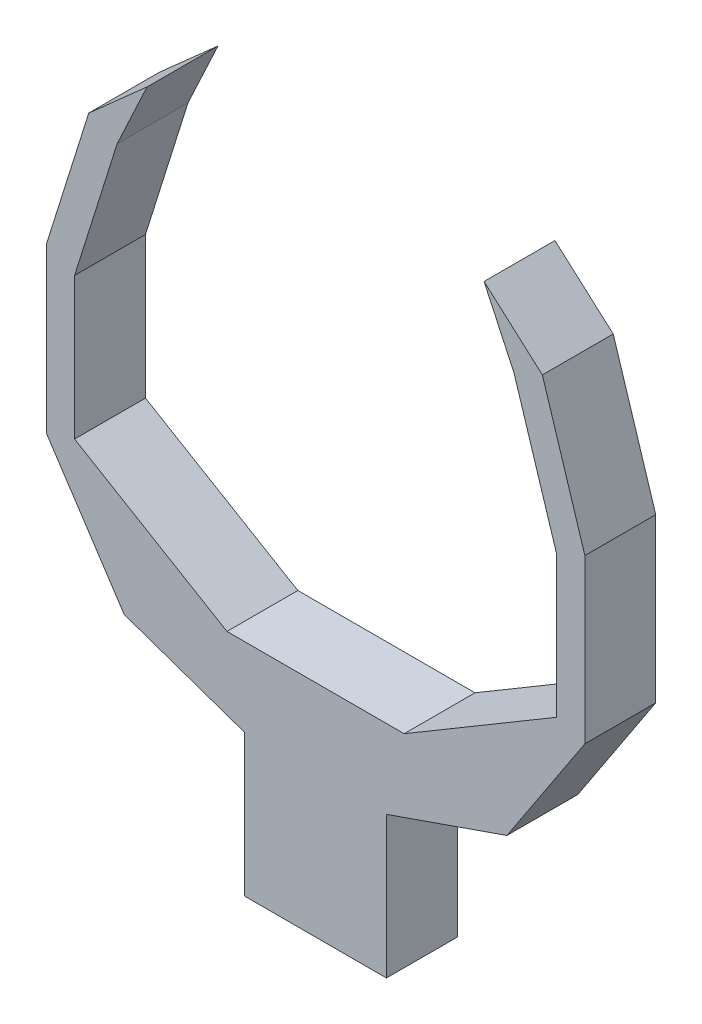
ISO-10303-21;
HEADER;
FILE_DESCRIPTION(('STEP AP214'),'2;1');
FILE_NAME('part.step','',(''),(''),'','','');
FILE_SCHEMA(('AUTOMOTIVE_DESIGN { 1 0 10303 214 1 1 1 1 }'));
ENDSEC;
DATA;
#1=APPLICATION_CONTEXT('core data for automotive mechanical design processes');
#2=APPLICATION_PROTOCOL_DEFINITION('international standard','automotive_design',2000,#1);
#3=PRODUCT_CONTEXT('',#1,'mechanical');
#4=PRODUCT('Part','Part','',(#3));
#5=PRODUCT_RELATED_PRODUCT_CATEGORY('part','',(#4));
#6=PRODUCT_DEFINITION_FORMATION('','',#4);
#7=PRODUCT_DEFINITION_CONTEXT('part definition',#1,'design');
#8=PRODUCT_DEFINITION('design','',#6,#7);
#9=PRODUCT_DEFINITION_SHAPE('','',#8);
#10=(LENGTH_UNIT() NAMED_UNIT(*) SI_UNIT(.MILLI.,.METRE.));
#11=(NAMED_UNIT(*) PLANE_ANGLE_UNIT() SI_UNIT($,.RADIAN.));
#12=(NAMED_UNIT(*) SI_UNIT($,.STERADIAN.) SOLID_ANGLE_UNIT());
#13=UNCERTAINTY_MEASURE_WITH_UNIT(LENGTH_MEASURE(1.E-05),#10,'distance_accuracy_value','');
#14=(GEOMETRIC_REPRESENTATION_CONTEXT(3) GLOBAL_UNCERTAINTY_ASSIGNED_CONTEXT((#13)) GLOBAL_UNIT_ASSIGNED_CONTEXT((#10,
#11,#12)) REPRESENTATION_CONTEXT('',''));
#15=CARTESIAN_POINT('',(0.,0.,0.));
#16=DIRECTION('',(0.,0.,1.));
#17=DIRECTION('',(1.,0.,0.));
#18=AXIS2_PLACEMENT_3D('',#15,#16,#17);
#19=CARTESIAN_POINT('',(-10.,-30.,183.065407233314));
#20=DIRECTION('',(1.,0.,0.));
#21=DIRECTION('',(0.,1.,0.));
#22=AXIS2_PLACEMENT_3D('',#19,#20,#21);
#23=PLANE('',#22);
#24=DIRECTION('',(0.,0.,-1.));
#25=VECTOR('',#24,1.);
#26=CARTESIAN_POINT('',(-10.,-30.,183.065407233314));
#27=LINE('',#26,#25);
#28=CARTESIAN_POINT('',(-10.,-30.,10.0000000000001));
#29=VERTEX_POINT('',#28);
#30=CARTESIAN_POINT('',(-10.,-30.,0.));
#31=VERTEX_POINT('',#30);
#32=EDGE_CURVE('E298',#29,#31,#27,.T.);
#33=ORIENTED_EDGE('',*,*,#32,.T.);
#34=DIRECTION('',(0.,-1.,0.));
#35=VECTOR('',#34,1.);
#36=CARTESIAN_POINT('',(-10.,-30.,0.));
#37=LINE('',#36,#35);
#38=CARTESIAN_POINT('',(-9.99999999999999,-50.,0.));
#39=VERTEX_POINT('',#38);
#40=EDGE_CURVE('E241',#31,#39,#37,.T.);
#41=ORIENTED_EDGE('',*,*,#40,.T.);
#42=DIRECTION('',(0.,0.,-1.));
#43=VECTOR('',#42,1.);
#44=CARTESIAN_POINT('',(-9.99999999999999,-50.,183.065407233314));
#45=LINE('',#44,#43);
#46=CARTESIAN_POINT('',(-9.99999999999999,-50.,10.0000000000001));
#47=VERTEX_POINT('',#46);
#48=EDGE_CURVE('E295',#47,#39,#45,.T.);
#49=ORIENTED_EDGE('',*,*,#48,.F.);
#50=DIRECTION('',(0.,-1.,0.));
#51=VECTOR('',#50,1.);
#52=CARTESIAN_POINT('',(-10.,-30.,10.));
#53=LINE('',#52,#51);
#54=EDGE_CURVE('E301',#29,#47,#53,.T.);
#55=ORIENTED_EDGE('',*,*,#54,.F.);
#56=EDGE_LOOP('',(#33,#41,#49,#55));
#57=FACE_BOUND('',#56,.T.);
#58=ADVANCED_FACE('F33',(#57),#23,.F.);
#59=CARTESIAN_POINT('',(-27.,-24.0839202169004,183.065407233314));
#60=DIRECTION('',(0.328671099061089,0.944444444444445,0.));
#61=DIRECTION('',(-0.944444444444445,0.328671099061089,0.));
#62=AXIS2_PLACEMENT_3D('',#59,#60,#61);
#63=PLANE('',#62);
#64=DIRECTION('',(0.,0.,-1.));
#65=VECTOR('',#64,1.);
#66=CARTESIAN_POINT('',(-27.,-24.0839202169004,183.065407233314));
#67=LINE('',#66,#65);
#68=CARTESIAN_POINT('',(-27.,-24.0839202169004,10.0000000000001));
#69=VERTEX_POINT('',#68);
#70=CARTESIAN_POINT('',(-27.,-24.0839202169004,0.));
#71=VERTEX_POINT('',#70);
#72=EDGE_CURVE('E292',#69,#71,#67,.T.);
#73=ORIENTED_EDGE('',*,*,#72,.T.);
#74=DIRECTION('',(0.944444444444445,-0.328671099061089,0.));
#75=VECTOR('',#74,1.);
#76=CARTESIAN_POINT('',(-27.,-24.0839202169004,0.));
#77=LINE('',#76,#75);
#78=EDGE_CURVE('E239',#71,#31,#77,.T.);
#79=ORIENTED_EDGE('',*,*,#78,.T.);
#80=ORIENTED_EDGE('',*,*,#32,.F.);
#81=DIRECTION('',(0.944444444444445,-0.328671099061089,0.));
#82=VECTOR('',#81,1.);
#83=CARTESIAN_POINT('',(-27.,-24.0839202169004,10.));
#84=LINE('',#83,#82);
#85=EDGE_CURVE('E303',#69,#29,#84,.T.);
#86=ORIENTED_EDGE('',*,*,#85,.F.);
#87=EDGE_LOOP('',(#73,#79,#80,#86));
#88=FACE_BOUND('',#87,.T.);
#89=ADVANCED_FACE('F370',(#88),#63,.F.);
#90=CARTESIAN_POINT('',(-38.,-7.38062712841036,183.065407233314));
#91=DIRECTION('',(0.835164654424502,0.550000000000001,0.));
#92=DIRECTION('',(-0.550000000000002,0.835164654424502,0.));
#93=AXIS2_PLACEMENT_3D('',#90,#91,#92);
#94=PLANE('',#93);
#95=DIRECTION('',(0.,0.,-1.));
#96=VECTOR('',#95,1.);
#97=CARTESIAN_POINT('',(-38.,-7.38062712841036,183.065407233314));
#98=LINE('',#97,#96);
#99=CARTESIAN_POINT('',(-38.,-7.38062712841036,10.0000000000001));
#100=VERTEX_POINT('',#99);
#101=CARTESIAN_POINT('',(-38.,-7.38062712841036,0.));
#102=VERTEX_POINT('',#101);
#103=EDGE_CURVE('E289',#100,#102,#98,.T.);
#104=ORIENTED_EDGE('',*,*,#103,.T.);
#105=DIRECTION('',(0.550000000000002,-0.835164654424502,0.));
#106=VECTOR('',#105,1.);
#107=CARTESIAN_POINT('',(-38.,-7.38062712841036,0.));
#108=LINE('',#107,#106);
#109=EDGE_CURVE('E237',#102,#71,#108,.T.);
#110=ORIENTED_EDGE('',*,*,#109,.T.);
#111=ORIENTED_EDGE('',*,*,#72,.F.);
#112=DIRECTION('',(0.550000000000002,-0.835164654424502,0.));
#113=VECTOR('',#112,1.);
#114=CARTESIAN_POINT('',(-38.,-7.38062712841036,10.));
#115=LINE('',#114,#113);
#116=EDGE_CURVE('E307',#100,#69,#115,.T.);
#117=ORIENTED_EDGE('',*,*,#116,.F.);
#118=EDGE_LOOP('',(#104,#110,#111,#117));
#119=FACE_BOUND('',#118,.T.);
#120=ADVANCED_FACE('F373',(#119),#94,.F.);
#121=CARTESIAN_POINT('',(-38.,15.6193728715896,183.065407233314));
#122=DIRECTION('',(1.,0.,0.));
#123=DIRECTION('',(0.,0.,-1.));
#124=AXIS2_PLACEMENT_3D('',#121,#122,#123);
#125=PLANE('',#124);
#126=DIRECTION('',(0.,0.,-1.));
#127=VECTOR('',#126,1.);
#128=CARTESIAN_POINT('',(-38.,15.6193728715896,183.065407233314));
#129=LINE('',#128,#127);
#130=CARTESIAN_POINT('',(-38.,15.6193728715896,10.0000000000001));
#131=VERTEX_POINT('',#130);
#132=CARTESIAN_POINT('',(-38.,15.6193728715896,0.));
#133=VERTEX_POINT('',#132);
#134=EDGE_CURVE('E286',#131,#133,#129,.T.);
#135=ORIENTED_EDGE('',*,*,#134,.T.);
#136=DIRECTION('',(0.,-1.,0.));
#137=VECTOR('',#136,1.);
#138=CARTESIAN_POINT('',(-38.,15.6193728715896,0.));
#139=LINE('',#138,#137);
#140=EDGE_CURVE('E235',#133,#102,#139,.T.);
#141=ORIENTED_EDGE('',*,*,#140,.T.);
#142=ORIENTED_EDGE('',*,*,#103,.F.);
#143=DIRECTION('',(0.,-1.,0.));
#144=VECTOR('',#143,1.);
#145=CARTESIAN_POINT('',(-38.,15.6193728715896,10.));
#146=LINE('',#145,#144);
#147=EDGE_CURVE('E310',#131,#100,#146,.T.);
#148=ORIENTED_EDGE('',*,*,#147,.F.);
#149=EDGE_LOOP('',(#135,#141,#142,#148));
#150=FACE_BOUND('',#149,.T.);
#151=ADVANCED_FACE('F378',(#150),#125,.F.);
#152=CARTESIAN_POINT('',(-32.,34.6981568999285,183.065407233314));
#153=DIRECTION('',(0.953939201416946,-0.3,0.));
#154=DIRECTION('',(0.3,0.953939201416946,0.));
#155=AXIS2_PLACEMENT_3D('',#152,#153,#154);
#156=PLANE('',#155);
#157=DIRECTION('',(0.,0.,-1.));
#158=VECTOR('',#157,1.);
#159=CARTESIAN_POINT('',(-32.,34.6981568999285,183.065407233314));
#160=LINE('',#159,#158);
#161=CARTESIAN_POINT('',(-32.,34.6981568999285,10.0000000000001));
#162=VERTEX_POINT('',#161);
#163=CARTESIAN_POINT('',(-32.,34.6981568999285,0.));
#164=VERTEX_POINT('',#163);
#165=EDGE_CURVE('E283',#162,#164,#160,.T.);
#166=ORIENTED_EDGE('',*,*,#165,.T.);
#167=DIRECTION('',(-0.3,-0.953939201416946,0.));
#168=VECTOR('',#167,1.);
#169=CARTESIAN_POINT('',(-32.,34.6981568999285,0.));
#170=LINE('',#169,#168);
#171=EDGE_CURVE('E233',#164,#133,#170,.T.);
#172=ORIENTED_EDGE('',*,*,#171,.T.);
#173=ORIENTED_EDGE('',*,*,#134,.F.);
#174=DIRECTION('',(-0.3,-0.953939201416946,0.));
#175=VECTOR('',#174,1.);
#176=CARTESIAN_POINT('',(-32.,34.6981568999285,10.));
#177=LINE('',#176,#175);
#178=EDGE_CURVE('E315',#162,#131,#177,.T.);
#179=ORIENTED_EDGE('',*,*,#178,.F.);
#180=EDGE_LOOP('',(#166,#172,#173,#179));
#181=FACE_BOUND('',#180,.T.);
#182=ADVANCED_FACE('F380',(#181),#156,.F.);
#183=CARTESIAN_POINT('',(-23.7730268420312,42.,183.065407233314));
#184=DIRECTION('',(0.663803918188315,-0.747906650724434,0.));
#185=DIRECTION('',(0.747906650724434,0.663803918188315,0.));
#186=AXIS2_PLACEMENT_3D('',#183,#184,#185);
#187=PLANE('',#186);
#188=DIRECTION('',(0.,0.,-1.));
#189=VECTOR('',#188,1.);
#190=CARTESIAN_POINT('',(-23.7730268420312,42.,183.065407233314));
#191=LINE('',#190,#189);
#192=CARTESIAN_POINT('',(-23.7730268420312,42.,10.0000000000001));
#193=VERTEX_POINT('',#192);
#194=CARTESIAN_POINT('',(-23.7730268420312,42.,0.));
#195=VERTEX_POINT('',#194);
#196=EDGE_CURVE('E280',#193,#195,#191,.T.);
#197=ORIENTED_EDGE('',*,*,#196,.T.);
#198=DIRECTION('',(-0.747906650724434,-0.663803918188315,0.));
#199=VECTOR('',#198,1.);
#200=CARTESIAN_POINT('',(-23.7730268420312,42.,0.));
#201=LINE('',#200,#199);
#202=EDGE_CURVE('E231',#195,#164,#201,.T.);
#203=ORIENTED_EDGE('',*,*,#202,.T.);
#204=ORIENTED_EDGE('',*,*,#165,.F.);
#205=DIRECTION('',(-0.747906650724434,-0.663803918188315,0.));
#206=VECTOR('',#205,1.);
#207=CARTESIAN_POINT('',(-23.7730268420312,42.,10.));
#208=LINE('',#207,#206);
#209=EDGE_CURVE('E318',#193,#162,#208,.T.);
#210=ORIENTED_EDGE('',*,*,#209,.F.);
#211=EDGE_LOOP('',(#197,#203,#204,#210));
#212=FACE_BOUND('',#211,.T.);
#213=ADVANCED_FACE('F387',(#212),#187,.F.);
#214=CARTESIAN_POINT('',(-28.,32.9372908067283,183.065407233314));
#215=DIRECTION('',(-0.90627091932717,0.422697315796877,0.));
#216=DIRECTION('',(-0.422697315796878,-0.906270919327171,0.));
#217=AXIS2_PLACEMENT_3D('',#214,#215,#216);
#218=PLANE('',#217);
#219=DIRECTION('',(0.,0.,-1.));
#220=VECTOR('',#219,1.);
#221=CARTESIAN_POINT('',(-28.,32.9372908067283,183.065407233314));
#222=LINE('',#221,#220);
#223=CARTESIAN_POINT('',(-28.,32.9372908067283,10.0000000000001));
#224=VERTEX_POINT('',#223);
#225=CARTESIAN_POINT('',(-28.,32.9372908067283,0.));
#226=VERTEX_POINT('',#225);
#227=EDGE_CURVE('E277',#224,#226,#222,.T.);
#228=ORIENTED_EDGE('',*,*,#227,.T.);
#229=DIRECTION('',(0.422697315796878,0.906270919327171,0.));
#230=VECTOR('',#229,1.);
#231=CARTESIAN_POINT('',(-28.,32.9372908067283,0.));
#232=LINE('',#231,#230);
#233=EDGE_CURVE('E229',#226,#195,#232,.T.);
#234=ORIENTED_EDGE('',*,*,#233,.T.);
#235=ORIENTED_EDGE('',*,*,#196,.F.);
#236=DIRECTION('',(0.422697315796878,0.906270919327171,0.));
#237=VECTOR('',#236,1.);
#238=CARTESIAN_POINT('',(-28.,32.9372908067283,10.));
#239=LINE('',#238,#237);
#240=EDGE_CURVE('E321',#224,#193,#239,.T.);
#241=ORIENTED_EDGE('',*,*,#240,.F.);
#242=EDGE_LOOP('',(#228,#234,#235,#241));
#243=FACE_BOUND('',#242,.T.);
#244=ADVANCED_FACE('F390',(#243),#218,.F.);
#245=CARTESIAN_POINT('',(-34.,13.8585067783894,183.065407233314));
#246=DIRECTION('',(-0.953939201416946,0.3,0.));
#247=DIRECTION('',(-0.3,-0.953939201416946,0.));
#248=AXIS2_PLACEMENT_3D('',#245,#246,#247);
#249=PLANE('',#248);
#250=DIRECTION('',(0.,0.,-1.));
#251=VECTOR('',#250,1.);
#252=CARTESIAN_POINT('',(-34.,13.8585067783894,183.065407233314));
#253=LINE('',#252,#251);
#254=CARTESIAN_POINT('',(-34.,13.8585067783894,10.0000000000001));
#255=VERTEX_POINT('',#254);
#256=CARTESIAN_POINT('',(-34.,13.8585067783894,0.));
#257=VERTEX_POINT('',#256);
#258=EDGE_CURVE('E274',#255,#257,#253,.T.);
#259=ORIENTED_EDGE('',*,*,#258,.T.);
#260=DIRECTION('',(0.3,0.953939201416946,0.));
#261=VECTOR('',#260,1.);
#262=CARTESIAN_POINT('',(-34.,13.8585067783894,0.));
#263=LINE('',#262,#261);
#264=EDGE_CURVE('E227',#257,#226,#263,.T.);
#265=ORIENTED_EDGE('',*,*,#264,.T.);
#266=ORIENTED_EDGE('',*,*,#227,.F.);
#267=DIRECTION('',(0.3,0.953939201416946,0.));
#268=VECTOR('',#267,1.);
#269=CARTESIAN_POINT('',(-34.,13.8585067783894,10.));
#270=LINE('',#269,#268);
#271=EDGE_CURVE('E324',#255,#224,#270,.T.);
#272=ORIENTED_EDGE('',*,*,#271,.F.);
#273=EDGE_LOOP('',(#259,#265,#266,#272));
#274=FACE_BOUND('',#273,.T.);
#275=ADVANCED_FACE('F394',(#274),#249,.F.);
#276=CARTESIAN_POINT('',(-34.,-6.1414932216106,183.065407233314));
#277=DIRECTION('',(-1.,0.,0.));
#278=DIRECTION('',(0.,-1.,0.));
#279=AXIS2_PLACEMENT_3D('',#276,#277,#278);
#280=PLANE('',#279);
#281=DIRECTION('',(0.,0.,-1.));
#282=VECTOR('',#281,1.);
#283=CARTESIAN_POINT('',(-34.,-6.1414932216106,183.065407233314));
#284=LINE('',#283,#282);
#285=CARTESIAN_POINT('',(-34.,-6.1414932216106,10.0000000000001));
#286=VERTEX_POINT('',#285);
#287=CARTESIAN_POINT('',(-34.,-6.1414932216106,0.));
#288=VERTEX_POINT('',#287);
#289=EDGE_CURVE('E271',#286,#288,#284,.T.);
#290=ORIENTED_EDGE('',*,*,#289,.T.);
#291=DIRECTION('',(0.,1.,0.));
#292=VECTOR('',#291,1.);
#293=CARTESIAN_POINT('',(-34.,-6.1414932216106,0.));
#294=LINE('',#293,#292);
#295=EDGE_CURVE('E225',#288,#257,#294,.T.);
#296=ORIENTED_EDGE('',*,*,#295,.T.);
#297=ORIENTED_EDGE('',*,*,#258,.F.);
#298=DIRECTION('',(0.,1.,0.));
#299=VECTOR('',#298,1.);
#300=CARTESIAN_POINT('',(-34.,-6.1414932216106,10.));
#301=LINE('',#300,#299);
#302=EDGE_CURVE('E327',#286,#255,#301,.T.);
#303=ORIENTED_EDGE('',*,*,#302,.F.);
#304=EDGE_LOOP('',(#290,#296,#297,#303));
#305=FACE_BOUND('',#304,.T.);
#306=ADVANCED_FACE('F396',(#305),#280,.F.);
#307=CARTESIAN_POINT('',(-12.5,-18.8988440437837,183.065407233314));
#308=DIRECTION('',(-0.510294032886923,-0.86,0.));
#309=DIRECTION('',(0.86,-0.510294032886923,0.));
#310=AXIS2_PLACEMENT_3D('',#307,#308,#309);
#311=PLANE('',#310);
#312=DIRECTION('',(0.,0.,-1.));
#313=VECTOR('',#312,1.);
#314=CARTESIAN_POINT('',(-12.5,-18.8988440437837,183.065407233314));
#315=LINE('',#314,#313);
#316=CARTESIAN_POINT('',(-12.5,-18.8988440437837,10.0000000000001));
#317=VERTEX_POINT('',#316);
#318=CARTESIAN_POINT('',(-12.5,-18.8988440437837,0.));
#319=VERTEX_POINT('',#318);
#320=EDGE_CURVE('E268',#317,#319,#315,.T.);
#321=ORIENTED_EDGE('',*,*,#320,.T.);
#322=DIRECTION('',(-0.86,0.510294032886923,0.));
#323=VECTOR('',#322,1.);
#324=CARTESIAN_POINT('',(-12.5,-18.8988440437837,0.));
#325=LINE('',#324,#323);
#326=EDGE_CURVE('E223',#319,#288,#325,.T.);
#327=ORIENTED_EDGE('',*,*,#326,.T.);
#328=ORIENTED_EDGE('',*,*,#289,.F.);
#329=DIRECTION('',(-0.86,0.510294032886923,0.));
#330=VECTOR('',#329,1.);
#331=CARTESIAN_POINT('',(-12.5,-18.8988440437837,10.));
#332=LINE('',#331,#330);
#333=EDGE_CURVE('E330',#317,#286,#332,.T.);
#334=ORIENTED_EDGE('',*,*,#333,.F.);
#335=EDGE_LOOP('',(#321,#327,#328,#334));
#336=FACE_BOUND('',#335,.T.);
#337=ADVANCED_FACE('F403',(#336),#311,.F.);
#338=CARTESIAN_POINT('',(12.5,-18.8988440437837,183.065407233314));
#339=DIRECTION('',(0.,-1.,0.));
#340=DIRECTION('',(1.,0.,0.));
#341=AXIS2_PLACEMENT_3D('',#338,#339,#340);
#342=PLANE('',#341);
#343=DIRECTION('',(0.,0.,-1.));
#344=VECTOR('',#343,1.);
#345=CARTESIAN_POINT('',(12.5,-18.8988440437837,183.065407233314));
#346=LINE('',#345,#344);
#347=CARTESIAN_POINT('',(12.5,-18.8988440437837,10.0000000000001));
#348=VERTEX_POINT('',#347);
#349=CARTESIAN_POINT('',(12.5,-18.8988440437837,0.));
#350=VERTEX_POINT('',#349);
#351=EDGE_CURVE('E265',#348,#350,#346,.T.);
#352=ORIENTED_EDGE('',*,*,#351,.T.);
#353=DIRECTION('',(-1.,0.,0.));
#354=VECTOR('',#353,1.);
#355=CARTESIAN_POINT('',(12.5,-18.8988440437837,0.));
#356=LINE('',#355,#354);
#357=EDGE_CURVE('E221',#350,#319,#356,.T.);
#358=ORIENTED_EDGE('',*,*,#357,.T.);
#359=ORIENTED_EDGE('',*,*,#320,.F.);
#360=DIRECTION('',(-1.,0.,0.));
#361=VECTOR('',#360,1.);
#362=CARTESIAN_POINT('',(12.5,-18.8988440437837,10.));
#363=LINE('',#362,#361);
#364=EDGE_CURVE('E333',#348,#317,#363,.T.);
#365=ORIENTED_EDGE('',*,*,#364,.F.);
#366=EDGE_LOOP('',(#352,#358,#359,#365));
#367=FACE_BOUND('',#366,.T.);
#368=ADVANCED_FACE('F406',(#367),#342,.F.);
#369=CARTESIAN_POINT('',(34.,-6.14149322161061,183.065407233314));
#370=DIRECTION('',(0.510294032886922,-0.86,0.));
#371=DIRECTION('',(0.860000000000001,0.510294032886922,0.));
#372=AXIS2_PLACEMENT_3D('',#369,#370,#371);
#373=PLANE('',#372);
#374=DIRECTION('',(0.,0.,-1.));
#375=VECTOR('',#374,1.);
#376=CARTESIAN_POINT('',(34.,-6.14149322161061,183.065407233314));
#377=LINE('',#376,#375);
#378=CARTESIAN_POINT('',(34.,-6.14149322161061,10.0000000000001));
#379=VERTEX_POINT('',#378);
#380=CARTESIAN_POINT('',(34.,-6.14149322161061,0.));
#381=VERTEX_POINT('',#380);
#382=EDGE_CURVE('E262',#379,#381,#377,.T.);
#383=ORIENTED_EDGE('',*,*,#382,.T.);
#384=DIRECTION('',(-0.860000000000001,-0.510294032886922,0.));
#385=VECTOR('',#384,1.);
#386=CARTESIAN_POINT('',(34.,-6.14149322161061,0.));
#387=LINE('',#386,#385);
#388=EDGE_CURVE('E219',#381,#350,#387,.T.);
#389=ORIENTED_EDGE('',*,*,#388,.T.);
#390=ORIENTED_EDGE('',*,*,#351,.F.);
#391=DIRECTION('',(-0.860000000000001,-0.510294032886922,0.));
#392=VECTOR('',#391,1.);
#393=CARTESIAN_POINT('',(34.,-6.14149322161061,10.));
#394=LINE('',#393,#392);
#395=EDGE_CURVE('E336',#379,#348,#394,.T.);
#396=ORIENTED_EDGE('',*,*,#395,.F.);
#397=EDGE_LOOP('',(#383,#389,#390,#396));
#398=FACE_BOUND('',#397,.T.);
#399=ADVANCED_FACE('F410',(#398),#373,.F.);
#400=CARTESIAN_POINT('',(34.,13.8585067783894,183.065407233314));
#401=DIRECTION('',(1.,0.,0.));
#402=DIRECTION('',(0.,1.,0.));
#403=AXIS2_PLACEMENT_3D('',#400,#401,#402);
#404=PLANE('',#403);
#405=DIRECTION('',(0.,0.,-1.));
#406=VECTOR('',#405,1.);
#407=CARTESIAN_POINT('',(34.,13.8585067783894,183.065407233314));
#408=LINE('',#407,#406);
#409=CARTESIAN_POINT('',(34.,13.8585067783894,10.0000000000001));
#410=VERTEX_POINT('',#409);
#411=CARTESIAN_POINT('',(34.,13.8585067783894,0.));
#412=VERTEX_POINT('',#411);
#413=EDGE_CURVE('E259',#410,#412,#408,.T.);
#414=ORIENTED_EDGE('',*,*,#413,.T.);
#415=DIRECTION('',(0.,-1.,0.));
#416=VECTOR('',#415,1.);
#417=CARTESIAN_POINT('',(34.,13.8585067783894,0.));
#418=LINE('',#417,#416);
#419=EDGE_CURVE('E217',#412,#381,#418,.T.);
#420=ORIENTED_EDGE('',*,*,#419,.T.);
#421=ORIENTED_EDGE('',*,*,#382,.F.);
#422=DIRECTION('',(0.,-1.,0.));
#423=VECTOR('',#422,1.);
#424=CARTESIAN_POINT('',(34.,13.8585067783894,10.));
#425=LINE('',#424,#423);
#426=EDGE_CURVE('E339',#410,#379,#425,.T.);
#427=ORIENTED_EDGE('',*,*,#426,.F.);
#428=EDGE_LOOP('',(#414,#420,#421,#427));
#429=FACE_BOUND('',#428,.T.);
#430=ADVANCED_FACE('F412',(#429),#404,.F.);
#431=CARTESIAN_POINT('',(28.,32.9372908067283,183.065407233314));
#432=DIRECTION('',(0.953939201416946,0.299999999999999,0.));
#433=DIRECTION('',(-0.299999999999999,0.953939201416946,0.));
#434=AXIS2_PLACEMENT_3D('',#431,#432,#433);
#435=PLANE('',#434);
#436=DIRECTION('',(0.,0.,-1.));
#437=VECTOR('',#436,1.);
#438=CARTESIAN_POINT('',(28.,32.9372908067283,183.065407233314));
#439=LINE('',#438,#437);
#440=CARTESIAN_POINT('',(28.,32.9372908067283,10.0000000000001));
#441=VERTEX_POINT('',#440);
#442=CARTESIAN_POINT('',(28.,32.9372908067283,0.));
#443=VERTEX_POINT('',#442);
#444=EDGE_CURVE('E256',#441,#443,#439,.T.);
#445=ORIENTED_EDGE('',*,*,#444,.T.);
#446=DIRECTION('',(0.299999999999999,-0.953939201416946,0.));
#447=VECTOR('',#446,1.);
#448=CARTESIAN_POINT('',(28.,32.9372908067283,0.));
#449=LINE('',#448,#447);
#450=EDGE_CURVE('E215',#443,#412,#449,.T.);
#451=ORIENTED_EDGE('',*,*,#450,.T.);
#452=ORIENTED_EDGE('',*,*,#413,.F.);
#453=DIRECTION('',(0.299999999999999,-0.953939201416946,0.));
#454=VECTOR('',#453,1.);
#455=CARTESIAN_POINT('',(28.,32.9372908067283,10.));
#456=LINE('',#455,#454);
#457=EDGE_CURVE('E342',#441,#410,#456,.T.);
#458=ORIENTED_EDGE('',*,*,#457,.F.);
#459=EDGE_LOOP('',(#445,#451,#452,#458));
#460=FACE_BOUND('',#459,.T.);
#461=ADVANCED_FACE('F419',(#460),#435,.F.);
#462=CARTESIAN_POINT('',(23.7730268420312,42.,183.065407233314));
#463=DIRECTION('',(0.906270919327168,0.422697315796882,0.));
#464=DIRECTION('',(-0.422697315796882,0.906270919327168,0.));
#465=AXIS2_PLACEMENT_3D('',#462,#463,#464);
#466=PLANE('',#465);
#467=DIRECTION('',(0.,0.,-1.));
#468=VECTOR('',#467,1.);
#469=CARTESIAN_POINT('',(23.7730268420312,42.,183.065407233314));
#470=LINE('',#469,#468);
#471=CARTESIAN_POINT('',(23.7730268420312,42.,10.0000000000001));
#472=VERTEX_POINT('',#471);
#473=CARTESIAN_POINT('',(23.7730268420312,42.,0.));
#474=VERTEX_POINT('',#473);
#475=EDGE_CURVE('E253',#472,#474,#470,.T.);
#476=ORIENTED_EDGE('',*,*,#475,.T.);
#477=DIRECTION('',(0.422697315796882,-0.906270919327168,0.));
#478=VECTOR('',#477,1.);
#479=CARTESIAN_POINT('',(23.7730268420312,42.,0.));
#480=LINE('',#479,#478);
#481=EDGE_CURVE('E213',#474,#443,#480,.T.);
#482=ORIENTED_EDGE('',*,*,#481,.T.);
#483=ORIENTED_EDGE('',*,*,#444,.F.);
#484=DIRECTION('',(0.422697315796882,-0.906270919327168,0.));
#485=VECTOR('',#484,1.);
#486=CARTESIAN_POINT('',(23.7730268420312,42.,10.));
#487=LINE('',#486,#485);
#488=EDGE_CURVE('E345',#472,#441,#487,.T.);
#489=ORIENTED_EDGE('',*,*,#488,.F.);
#490=EDGE_LOOP('',(#476,#482,#483,#489));
#491=FACE_BOUND('',#490,.T.);
#492=ADVANCED_FACE('F422',(#491),#466,.F.);
#493=CARTESIAN_POINT('',(32.,34.6981568999286,183.065407233314));
#494=DIRECTION('',(-0.663803918188309,-0.747906650724439,0.));
#495=DIRECTION('',(0.747906650724439,-0.66380391818831,0.));
#496=AXIS2_PLACEMENT_3D('',#493,#494,#495);
#497=PLANE('',#496);
#498=DIRECTION('',(0.,0.,-1.));
#499=VECTOR('',#498,1.);
#500=CARTESIAN_POINT('',(32.,34.6981568999286,183.065407233314));
#501=LINE('',#500,#499);
#502=CARTESIAN_POINT('',(32.,34.6981568999286,10.0000000000001));
#503=VERTEX_POINT('',#502);
#504=CARTESIAN_POINT('',(32.,34.6981568999286,0.));
#505=VERTEX_POINT('',#504);
#506=EDGE_CURVE('E250',#503,#505,#501,.T.);
#507=ORIENTED_EDGE('',*,*,#506,.T.);
#508=DIRECTION('',(-0.747906650724439,0.66380391818831,0.));
#509=VECTOR('',#508,1.);
#510=CARTESIAN_POINT('',(32.,34.6981568999286,0.));
#511=LINE('',#510,#509);
#512=EDGE_CURVE('E211',#505,#474,#511,.T.);
#513=ORIENTED_EDGE('',*,*,#512,.T.);
#514=ORIENTED_EDGE('',*,*,#475,.F.);
#515=DIRECTION('',(-0.747906650724439,0.66380391818831,0.));
#516=VECTOR('',#515,1.);
#517=CARTESIAN_POINT('',(32.,34.6981568999286,10.));
#518=LINE('',#517,#516);
#519=EDGE_CURVE('E348',#503,#472,#518,.T.);
#520=ORIENTED_EDGE('',*,*,#519,.F.);
#521=EDGE_LOOP('',(#507,#513,#514,#520));
#522=FACE_BOUND('',#521,.T.);
#523=ADVANCED_FACE('F426',(#522),#497,.F.);
#524=CARTESIAN_POINT('',(38.,15.6193728715897,183.065407233314));
#525=DIRECTION('',(-0.953939201416946,-0.299999999999999,0.));
#526=DIRECTION('',(0.299999999999999,-0.953939201416946,0.));
#527=AXIS2_PLACEMENT_3D('',#524,#525,#526);
#528=PLANE('',#527);
#529=DIRECTION('',(0.,0.,-1.));
#530=VECTOR('',#529,1.);
#531=CARTESIAN_POINT('',(38.,15.6193728715897,183.065407233314));
#532=LINE('',#531,#530);
#533=CARTESIAN_POINT('',(38.,15.6193728715897,10.0000000000001));
#534=VERTEX_POINT('',#533);
#535=CARTESIAN_POINT('',(38.,15.6193728715897,0.));
#536=VERTEX_POINT('',#535);
#537=EDGE_CURVE('E247',#534,#536,#532,.T.);
#538=ORIENTED_EDGE('',*,*,#537,.T.);
#539=DIRECTION('',(-0.299999999999999,0.953939201416946,0.));
#540=VECTOR('',#539,1.);
#541=CARTESIAN_POINT('',(38.,15.6193728715897,0.));
#542=LINE('',#541,#540);
#543=EDGE_CURVE('E206',#536,#505,#542,.T.);
#544=ORIENTED_EDGE('',*,*,#543,.T.);
#545=ORIENTED_EDGE('',*,*,#506,.F.);
#546=DIRECTION('',(-0.299999999999999,0.953939201416946,0.));
#547=VECTOR('',#546,1.);
#548=CARTESIAN_POINT('',(38.,15.6193728715897,10.));
#549=LINE('',#548,#547);
#550=EDGE_CURVE('E351',#534,#503,#549,.T.);
#551=ORIENTED_EDGE('',*,*,#550,.F.);
#552=EDGE_LOOP('',(#538,#544,#545,#551));
#553=FACE_BOUND('',#552,.T.);
#554=ADVANCED_FACE('F428',(#553),#528,.F.);
#555=CARTESIAN_POINT('',(38.,-7.38062712841031,183.065407233314));
#556=DIRECTION('',(-1.,0.,0.));
#557=DIRECTION('',(0.,0.,1.));
#558=AXIS2_PLACEMENT_3D('',#555,#556,#557);
#559=PLANE('',#558);
#560=DIRECTION('',(0.,0.,-1.));
#561=VECTOR('',#560,1.);
#562=CARTESIAN_POINT('',(38.,-7.38062712841031,183.065407233314));
#563=LINE('',#562,#561);
#564=CARTESIAN_POINT('',(38.,-7.38062712841031,10.0000000000001));
#565=VERTEX_POINT('',#564);
#566=CARTESIAN_POINT('',(38.,-7.38062712841031,0.));
#567=VERTEX_POINT('',#566);
#568=EDGE_CURVE('E198',#565,#567,#563,.T.);
#569=ORIENTED_EDGE('',*,*,#568,.T.);
#570=DIRECTION('',(0.,1.,0.));
#571=VECTOR('',#570,1.);
#572=CARTESIAN_POINT('',(38.,-7.38062712841031,0.));
#573=LINE('',#572,#571);
#574=EDGE_CURVE('E204',#567,#536,#573,.T.);
#575=ORIENTED_EDGE('',*,*,#574,.T.);
#576=ORIENTED_EDGE('',*,*,#537,.F.);
#577=DIRECTION('',(0.,1.,0.));
#578=VECTOR('',#577,1.);
#579=CARTESIAN_POINT('',(38.,-7.38062712841031,10.));
#580=LINE('',#579,#578);
#581=EDGE_CURVE('E354',#565,#534,#580,.T.);
#582=ORIENTED_EDGE('',*,*,#581,.F.);
#583=EDGE_LOOP('',(#569,#575,#576,#582));
#584=FACE_BOUND('',#583,.T.);
#585=ADVANCED_FACE('F431',(#584),#559,.F.);
#586=CARTESIAN_POINT('',(27.,-24.0839202169004,183.065407233314));
#587=DIRECTION('',(-0.835164654424504,0.549999999999999,0.));
#588=DIRECTION('',(-0.549999999999999,-0.835164654424504,0.));
#589=AXIS2_PLACEMENT_3D('',#586,#587,#588);
#590=PLANE('',#589);
#591=DIRECTION('',(0.,0.,-1.));
#592=VECTOR('',#591,1.);
#593=CARTESIAN_POINT('',(27.,-24.0839202169004,183.065407233314));
#594=LINE('',#593,#592);
#595=CARTESIAN_POINT('',(27.,-24.0839202169004,10.0000000000001));
#596=VERTEX_POINT('',#595);
#597=CARTESIAN_POINT('',(27.,-24.0839202169004,0.));
#598=VERTEX_POINT('',#597);
#599=EDGE_CURVE('E184',#596,#598,#594,.T.);
#600=ORIENTED_EDGE('',*,*,#599,.T.);
#601=DIRECTION('',(0.549999999999999,0.835164654424504,0.));
#602=VECTOR('',#601,1.);
#603=CARTESIAN_POINT('',(27.,-24.0839202169004,0.));
#604=LINE('',#603,#602);
#605=EDGE_CURVE('E189',#598,#567,#604,.T.);
#606=ORIENTED_EDGE('',*,*,#605,.T.);
#607=ORIENTED_EDGE('',*,*,#568,.F.);
#608=DIRECTION('',(0.549999999999999,0.835164654424504,0.));
#609=VECTOR('',#608,1.);
#610=CARTESIAN_POINT('',(27.,-24.0839202169004,10.));
#611=LINE('',#610,#609);
#612=EDGE_CURVE('E197',#596,#565,#611,.T.);
#613=ORIENTED_EDGE('',*,*,#612,.F.);
#614=EDGE_LOOP('',(#600,#606,#607,#613));
#615=FACE_BOUND('',#614,.T.);
#616=ADVANCED_FACE('F193',(#615),#590,.F.);
#617=CARTESIAN_POINT('',(10.,-30.,183.065407233314));
#618=DIRECTION('',(-0.328671099061089,0.944444444444445,0.));
#619=DIRECTION('',(-0.944444444444445,-0.328671099061089,0.));
#620=AXIS2_PLACEMENT_3D('',#617,#618,#619);
#621=PLANE('',#620);
#622=DIRECTION('',(0.,0.,-1.));
#623=VECTOR('',#622,1.);
#624=CARTESIAN_POINT('',(10.,-30.,183.065407233314));
#625=LINE('',#624,#623);
#626=CARTESIAN_POINT('',(10.,-30.,10.0000000000001));
#627=VERTEX_POINT('',#626);
#628=CARTESIAN_POINT('',(10.,-30.,0.));
#629=VERTEX_POINT('',#628);
#630=EDGE_CURVE('E48',#627,#629,#625,.T.);
#631=ORIENTED_EDGE('',*,*,#630,.T.);
#632=DIRECTION('',(0.944444444444445,0.328671099061089,0.));
#633=VECTOR('',#632,1.);
#634=CARTESIAN_POINT('',(10.,-30.,0.));
#635=LINE('',#634,#633);
#636=EDGE_CURVE('E181',#629,#598,#635,.T.);
#637=ORIENTED_EDGE('',*,*,#636,.T.);
#638=ORIENTED_EDGE('',*,*,#599,.F.);
#639=DIRECTION('',(0.944444444444445,0.328671099061089,0.));
#640=VECTOR('',#639,1.);
#641=CARTESIAN_POINT('',(10.,-30.,10.));
#642=LINE('',#641,#640);
#643=EDGE_CURVE('E358',#627,#596,#642,.T.);
#644=ORIENTED_EDGE('',*,*,#643,.F.);
#645=EDGE_LOOP('',(#631,#637,#638,#644));
#646=FACE_BOUND('',#645,.T.);
#647=ADVANCED_FACE('F183',(#646),#621,.F.);
#648=CARTESIAN_POINT('',(10.,-50.,183.065407233314));
#649=DIRECTION('',(-1.,0.,0.));
#650=DIRECTION('',(0.,0.,1.));
#651=AXIS2_PLACEMENT_3D('',#648,#649,#650);
#652=PLANE('',#651);
#653=DIRECTION('',(0.,0.,-1.));
#654=VECTOR('',#653,1.);
#655=CARTESIAN_POINT('',(10.,-50.,183.065407233314));
#656=LINE('',#655,#654);
#657=CARTESIAN_POINT('',(10.,-50.,10.0000000000001));
#658=VERTEX_POINT('',#657);
#659=CARTESIAN_POINT('',(10.,-50.,0.));
#660=VERTEX_POINT('',#659);
#661=EDGE_CURVE('E243',#658,#660,#656,.T.);
#662=ORIENTED_EDGE('',*,*,#661,.T.);
#663=DIRECTION('',(0.,1.,0.));
#664=VECTOR('',#663,1.);
#665=CARTESIAN_POINT('',(10.,-50.,0.));
#666=LINE('',#665,#664);
#667=EDGE_CURVE('E190',#660,#629,#666,.T.);
#668=ORIENTED_EDGE('',*,*,#667,.T.);
#669=ORIENTED_EDGE('',*,*,#630,.F.);
#670=DIRECTION('',(0.,1.,0.));
#671=VECTOR('',#670,1.);
#672=CARTESIAN_POINT('',(10.,-50.,10.));
#673=LINE('',#672,#671);
#674=EDGE_CURVE('E55',#658,#627,#673,.T.);
#675=ORIENTED_EDGE('',*,*,#674,.F.);
#676=EDGE_LOOP('',(#662,#668,#669,#675));
#677=FACE_BOUND('',#676,.T.);
#678=ADVANCED_FACE('F360',(#677),#652,.F.);
#679=CARTESIAN_POINT('',(-40.,-50.,10.));
#680=DIRECTION('',(0.,1.,0.));
#681=DIRECTION('',(0.,0.,1.));
#682=AXIS2_PLACEMENT_3D('',#679,#680,#681);
#683=PLANE('',#682);
#684=DIRECTION('',(1.,0.,0.));
#685=VECTOR('',#684,1.);
#686=CARTESIAN_POINT('',(-40.,-50.,10.));
#687=LINE('',#686,#685);
#688=EDGE_CURVE('E11',#47,#658,#687,.T.);
#689=ORIENTED_EDGE('',*,*,#688,.F.);
#690=ORIENTED_EDGE('',*,*,#48,.T.);
#691=DIRECTION('',(1.,0.,0.));
#692=VECTOR('',#691,1.);
#693=CARTESIAN_POINT('',(-40.,-50.,0.));
#694=LINE('',#693,#692);
#695=EDGE_CURVE('E37',#39,#660,#694,.T.);
#696=ORIENTED_EDGE('',*,*,#695,.T.);
#697=ORIENTED_EDGE('',*,*,#661,.F.);
#698=EDGE_LOOP('',(#689,#690,#696,#697));
#699=FACE_BOUND('',#698,.T.);
#700=ADVANCED_FACE('F35',(#699),#683,.F.);
#701=CARTESIAN_POINT('',(0.,0.,10.));
#702=DIRECTION('',(0.,0.,1.));
#703=DIRECTION('',(1.,0.,0.));
#704=AXIS2_PLACEMENT_3D('',#701,#702,#703);
#705=PLANE('',#704);
#706=ORIENTED_EDGE('',*,*,#85,.T.);
#707=ORIENTED_EDGE('',*,*,#54,.T.);
#708=ORIENTED_EDGE('',*,*,#688,.T.);
#709=ORIENTED_EDGE('',*,*,#674,.T.);
#710=ORIENTED_EDGE('',*,*,#643,.T.);
#711=ORIENTED_EDGE('',*,*,#612,.T.);
#712=ORIENTED_EDGE('',*,*,#581,.T.);
#713=ORIENTED_EDGE('',*,*,#550,.T.);
#714=ORIENTED_EDGE('',*,*,#519,.T.);
#715=ORIENTED_EDGE('',*,*,#488,.T.);
#716=ORIENTED_EDGE('',*,*,#457,.T.);
#717=ORIENTED_EDGE('',*,*,#426,.T.);
#718=ORIENTED_EDGE('',*,*,#395,.T.);
#719=ORIENTED_EDGE('',*,*,#364,.T.);
#720=ORIENTED_EDGE('',*,*,#333,.T.);
#721=ORIENTED_EDGE('',*,*,#302,.T.);
#722=ORIENTED_EDGE('',*,*,#271,.T.);
#723=ORIENTED_EDGE('',*,*,#240,.T.);
#724=ORIENTED_EDGE('',*,*,#209,.T.);
#725=ORIENTED_EDGE('',*,*,#178,.T.);
#726=ORIENTED_EDGE('',*,*,#147,.T.);
#727=ORIENTED_EDGE('',*,*,#116,.T.);
#728=EDGE_LOOP('',(#706,#707,#708,#709,#710,#711,#712,#713,#714,#715,#716,#717,#718,#719,#720,
#721,#722,#723,#724,#725,#726,#727));
#729=FACE_BOUND('',#728,.T.);
#730=ADVANCED_FACE('F375',(#729),#705,.T.);
#731=CARTESIAN_POINT('',(0.,0.,0.));
#732=DIRECTION('',(0.,0.,1.));
#733=DIRECTION('',(1.,0.,0.));
#734=AXIS2_PLACEMENT_3D('',#731,#732,#733);
#735=PLANE('',#734);
#736=ORIENTED_EDGE('',*,*,#40,.F.);
#737=ORIENTED_EDGE('',*,*,#78,.F.);
#738=ORIENTED_EDGE('',*,*,#109,.F.);
#739=ORIENTED_EDGE('',*,*,#140,.F.);
#740=ORIENTED_EDGE('',*,*,#171,.F.);
#741=ORIENTED_EDGE('',*,*,#202,.F.);
#742=ORIENTED_EDGE('',*,*,#233,.F.);
#743=ORIENTED_EDGE('',*,*,#264,.F.);
#744=ORIENTED_EDGE('',*,*,#295,.F.);
#745=ORIENTED_EDGE('',*,*,#326,.F.);
#746=ORIENTED_EDGE('',*,*,#357,.F.);
#747=ORIENTED_EDGE('',*,*,#388,.F.);
#748=ORIENTED_EDGE('',*,*,#419,.F.);
#749=ORIENTED_EDGE('',*,*,#450,.F.);
#750=ORIENTED_EDGE('',*,*,#481,.F.);
#751=ORIENTED_EDGE('',*,*,#512,.F.);
#752=ORIENTED_EDGE('',*,*,#543,.F.);
#753=ORIENTED_EDGE('',*,*,#574,.F.);
#754=ORIENTED_EDGE('',*,*,#605,.F.);
#755=ORIENTED_EDGE('',*,*,#636,.F.);
#756=ORIENTED_EDGE('',*,*,#667,.F.);
#757=ORIENTED_EDGE('',*,*,#695,.F.);
#758=EDGE_LOOP('',(#736,#737,#738,#739,#740,#741,#742,#743,#744,#745,#746,#747,#748,#749,#750,
#751,#752,#753,#754,#755,#756,#757));
#759=FACE_BOUND('',#758,.T.);
#760=ADVANCED_FACE('F202',(#759),#735,.F.);
#761=CLOSED_SHELL('',(#58,#89,#120,#151,#182,#213,#244,#275,#306,#337,#368,#399,#430,#461,#492,
#523,#554,#585,#616,#647,#678,#700,#730,#760));
#762=MANIFOLD_SOLID_BREP('B2',#761);
#763=ADVANCED_BREP_SHAPE_REPRESENTATION('',(#18,#762),#14);
#764=SHAPE_DEFINITION_REPRESENTATION(#9,#763);
ENDSEC;
END-ISO-10303-21;
